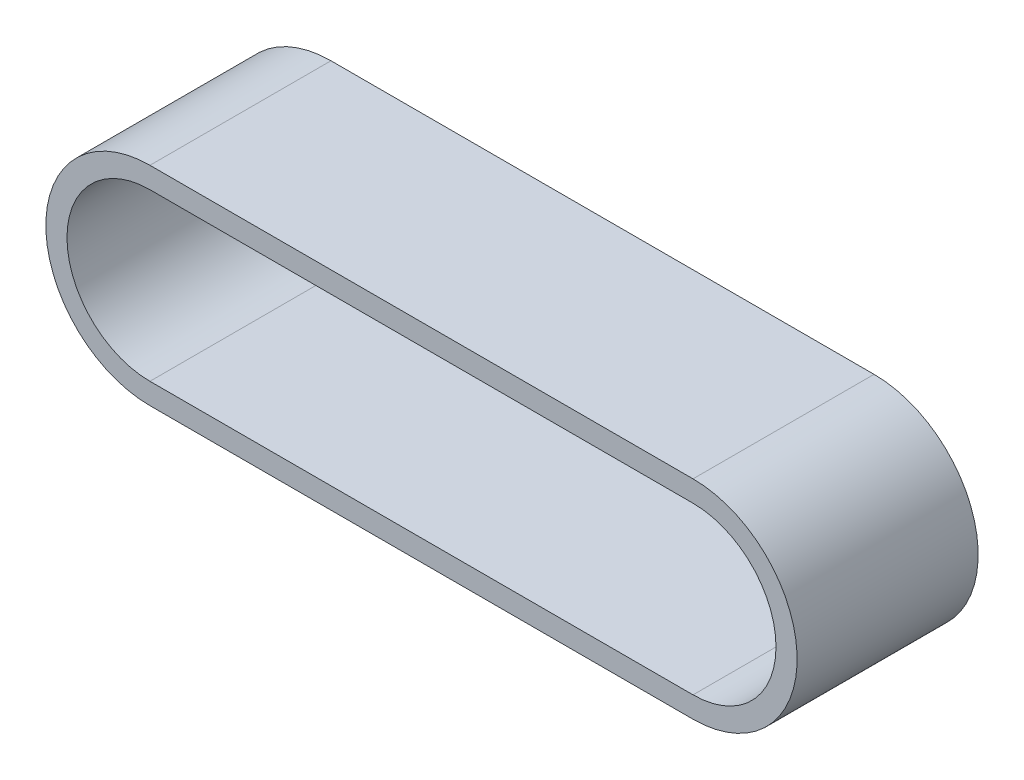
ISO-10303-21;
HEADER;
FILE_DESCRIPTION(('STEP AP214'),'2;1');
FILE_NAME('part.step','',(''),(''),'','','');
FILE_SCHEMA(('AUTOMOTIVE_DESIGN { 1 0 10303 214 1 1 1 1 }'));
ENDSEC;
DATA;
#1=APPLICATION_CONTEXT('core data for automotive mechanical design processes');
#2=APPLICATION_PROTOCOL_DEFINITION('international standard','automotive_design',2000,#1);
#3=PRODUCT_CONTEXT('',#1,'mechanical');
#4=PRODUCT('Part','Part','',(#3));
#5=PRODUCT_RELATED_PRODUCT_CATEGORY('part','',(#4));
#6=PRODUCT_DEFINITION_FORMATION('','',#4);
#7=PRODUCT_DEFINITION_CONTEXT('part definition',#1,'design');
#8=PRODUCT_DEFINITION('design','',#6,#7);
#9=PRODUCT_DEFINITION_SHAPE('','',#8);
#10=(LENGTH_UNIT() NAMED_UNIT(*) SI_UNIT(.MILLI.,.METRE.));
#11=(NAMED_UNIT(*) PLANE_ANGLE_UNIT() SI_UNIT($,.RADIAN.));
#12=(NAMED_UNIT(*) SI_UNIT($,.STERADIAN.) SOLID_ANGLE_UNIT());
#13=UNCERTAINTY_MEASURE_WITH_UNIT(LENGTH_MEASURE(1.E-05),#10,'distance_accuracy_value','');
#14=(GEOMETRIC_REPRESENTATION_CONTEXT(3) GLOBAL_UNCERTAINTY_ASSIGNED_CONTEXT((#13)) GLOBAL_UNIT_ASSIGNED_CONTEXT((#10,
#11,#12)) REPRESENTATION_CONTEXT('',''));
#15=CARTESIAN_POINT('',(0.,0.,0.));
#16=DIRECTION('',(0.,0.,1.));
#17=DIRECTION('',(1.,0.,0.));
#18=AXIS2_PLACEMENT_3D('',#15,#16,#17);
#19=CARTESIAN_POINT('',(0.,0.,12.));
#20=DIRECTION('',(0.,0.,1.));
#21=DIRECTION('',(1.,0.,0.));
#22=AXIS2_PLACEMENT_3D('',#19,#20,#21);
#23=PLANE('',#22);
#24=CARTESIAN_POINT('',(0.,0.,12.));
#25=DIRECTION('',(0.,0.,1.));
#26=DIRECTION('',(1.,0.,0.));
#27=AXIS2_PLACEMENT_3D('',#24,#25,#26);
#28=CIRCLE('',#27,6.9);
#29=CARTESIAN_POINT('',(0.,6.9,12.));
#30=VERTEX_POINT('',#29);
#31=CARTESIAN_POINT('',(0.,-6.9,12.));
#32=VERTEX_POINT('',#31);
#33=EDGE_CURVE('E135',#30,#32,#28,.T.);
#34=ORIENTED_EDGE('',*,*,#33,.T.);
#35=DIRECTION('',(1.,0.,0.));
#36=VECTOR('',#35,1.);
#37=CARTESIAN_POINT('',(0.,-6.9,12.));
#38=LINE('',#37,#36);
#39=CARTESIAN_POINT('',(36.,-6.9,12.));
#40=VERTEX_POINT('',#39);
#41=EDGE_CURVE('E138',#32,#40,#38,.T.);
#42=ORIENTED_EDGE('',*,*,#41,.T.);
#43=CARTESIAN_POINT('',(36.,0.,12.));
#44=DIRECTION('',(0.,0.,1.));
#45=DIRECTION('',(1.,0.,0.));
#46=AXIS2_PLACEMENT_3D('',#43,#44,#45);
#47=CIRCLE('',#46,6.9);
#48=CARTESIAN_POINT('',(36.,6.9,12.));
#49=VERTEX_POINT('',#48);
#50=EDGE_CURVE('E141',#40,#49,#47,.T.);
#51=ORIENTED_EDGE('',*,*,#50,.T.);
#52=DIRECTION('',(-1.,0.,0.));
#53=VECTOR('',#52,1.);
#54=CARTESIAN_POINT('',(0.,6.9,12.));
#55=LINE('',#54,#53);
#56=EDGE_CURVE('E143',#49,#30,#55,.T.);
#57=ORIENTED_EDGE('',*,*,#56,.T.);
#58=EDGE_LOOP('',(#34,#42,#51,#57));
#59=FACE_BOUND('',#58,.T.);
#60=DIRECTION('',(1.,0.,0.));
#61=VECTOR('',#60,1.);
#62=CARTESIAN_POINT('',(0.,-5.5,12.));
#63=LINE('',#62,#61);
#64=CARTESIAN_POINT('',(0.,-5.5,12.));
#65=VERTEX_POINT('',#64);
#66=CARTESIAN_POINT('',(36.,-5.5,12.));
#67=VERTEX_POINT('',#66);
#68=EDGE_CURVE('E107',#65,#67,#63,.T.);
#69=ORIENTED_EDGE('',*,*,#68,.F.);
#70=CARTESIAN_POINT('',(0.,0.,12.));
#71=DIRECTION('',(0.,0.,1.));
#72=DIRECTION('',(1.,0.,0.));
#73=AXIS2_PLACEMENT_3D('',#70,#71,#72);
#74=CIRCLE('',#73,5.5);
#75=CARTESIAN_POINT('',(0.,5.5,12.));
#76=VERTEX_POINT('',#75);
#77=EDGE_CURVE('E99',#76,#65,#74,.T.);
#78=ORIENTED_EDGE('',*,*,#77,.F.);
#79=DIRECTION('',(-1.,0.,0.));
#80=VECTOR('',#79,1.);
#81=CARTESIAN_POINT('',(0.,5.5,12.));
#82=LINE('',#81,#80);
#83=CARTESIAN_POINT('',(36.,5.5,12.));
#84=VERTEX_POINT('',#83);
#85=EDGE_CURVE('E121',#84,#76,#82,.T.);
#86=ORIENTED_EDGE('',*,*,#85,.F.);
#87=CARTESIAN_POINT('',(36.,0.,12.));
#88=DIRECTION('',(0.,0.,1.));
#89=DIRECTION('',(1.,0.,0.));
#90=AXIS2_PLACEMENT_3D('',#87,#88,#89);
#91=CIRCLE('',#90,5.5);
#92=EDGE_CURVE('E119',#67,#84,#91,.T.);
#93=ORIENTED_EDGE('',*,*,#92,.F.);
#94=EDGE_LOOP('',(#69,#78,#86,#93));
#95=FACE_BOUND('',#94,.T.);
#96=ADVANCED_FACE('F34',(#59,#95),#23,.T.);
#97=CARTESIAN_POINT('',(0.,0.,0.));
#98=DIRECTION('',(0.,0.,1.));
#99=DIRECTION('',(1.,0.,0.));
#100=AXIS2_PLACEMENT_3D('',#97,#98,#99);
#101=PLANE('',#100);
#102=CARTESIAN_POINT('',(0.,0.,0.));
#103=DIRECTION('',(0.,0.,1.));
#104=DIRECTION('',(1.,0.,0.));
#105=AXIS2_PLACEMENT_3D('',#102,#103,#104);
#106=CIRCLE('',#105,6.9);
#107=CARTESIAN_POINT('',(0.,6.9,0.));
#108=VERTEX_POINT('',#107);
#109=CARTESIAN_POINT('',(0.,-6.9,0.));
#110=VERTEX_POINT('',#109);
#111=EDGE_CURVE('E115',#108,#110,#106,.T.);
#112=ORIENTED_EDGE('',*,*,#111,.F.);
#113=DIRECTION('',(-1.,0.,0.));
#114=VECTOR('',#113,1.);
#115=CARTESIAN_POINT('',(0.,6.9,0.));
#116=LINE('',#115,#114);
#117=CARTESIAN_POINT('',(36.,6.9,0.));
#118=VERTEX_POINT('',#117);
#119=EDGE_CURVE('E139',#118,#108,#116,.T.);
#120=ORIENTED_EDGE('',*,*,#119,.F.);
#121=CARTESIAN_POINT('',(36.,0.,0.));
#122=DIRECTION('',(0.,0.,1.));
#123=DIRECTION('',(1.,0.,0.));
#124=AXIS2_PLACEMENT_3D('',#121,#122,#123);
#125=CIRCLE('',#124,6.9);
#126=CARTESIAN_POINT('',(36.,-6.9,0.));
#127=VERTEX_POINT('',#126);
#128=EDGE_CURVE('E150',#127,#118,#125,.T.);
#129=ORIENTED_EDGE('',*,*,#128,.F.);
#130=DIRECTION('',(1.,0.,0.));
#131=VECTOR('',#130,1.);
#132=CARTESIAN_POINT('',(0.,-6.9,0.));
#133=LINE('',#132,#131);
#134=EDGE_CURVE('E148',#110,#127,#133,.T.);
#135=ORIENTED_EDGE('',*,*,#134,.F.);
#136=EDGE_LOOP('',(#112,#120,#129,#135));
#137=FACE_BOUND('',#136,.T.);
#138=CARTESIAN_POINT('',(0.,0.,0.));
#139=DIRECTION('',(0.,0.,1.));
#140=DIRECTION('',(1.,0.,0.));
#141=AXIS2_PLACEMENT_3D('',#138,#139,#140);
#142=CIRCLE('',#141,5.5);
#143=CARTESIAN_POINT('',(0.,5.5,0.));
#144=VERTEX_POINT('',#143);
#145=CARTESIAN_POINT('',(0.,-5.5,0.));
#146=VERTEX_POINT('',#145);
#147=EDGE_CURVE('E57',#144,#146,#142,.T.);
#148=ORIENTED_EDGE('',*,*,#147,.T.);
#149=DIRECTION('',(1.,0.,0.));
#150=VECTOR('',#149,1.);
#151=CARTESIAN_POINT('',(0.,-5.5,0.));
#152=LINE('',#151,#150);
#153=CARTESIAN_POINT('',(36.,-5.5,0.));
#154=VERTEX_POINT('',#153);
#155=EDGE_CURVE('E114',#146,#154,#152,.T.);
#156=ORIENTED_EDGE('',*,*,#155,.T.);
#157=CARTESIAN_POINT('',(36.,0.,0.));
#158=DIRECTION('',(0.,0.,1.));
#159=DIRECTION('',(1.,0.,0.));
#160=AXIS2_PLACEMENT_3D('',#157,#158,#159);
#161=CIRCLE('',#160,5.5);
#162=CARTESIAN_POINT('',(36.,5.5,0.));
#163=VERTEX_POINT('',#162);
#164=EDGE_CURVE('E127',#154,#163,#161,.T.);
#165=ORIENTED_EDGE('',*,*,#164,.T.);
#166=DIRECTION('',(-1.,0.,0.));
#167=VECTOR('',#166,1.);
#168=CARTESIAN_POINT('',(0.,5.5,0.));
#169=LINE('',#168,#167);
#170=EDGE_CURVE('E108',#163,#144,#169,.T.);
#171=ORIENTED_EDGE('',*,*,#170,.T.);
#172=EDGE_LOOP('',(#148,#156,#165,#171));
#173=FACE_BOUND('',#172,.T.);
#174=ADVANCED_FACE('F168',(#137,#173),#101,.F.);
#175=CARTESIAN_POINT('',(0.,0.,12.));
#176=DIRECTION('',(0.,0.,-1.));
#177=DIRECTION('',(-1.,0.,0.));
#178=AXIS2_PLACEMENT_3D('',#175,#176,#177);
#179=CYLINDRICAL_SURFACE('',#178,6.9);
#180=ORIENTED_EDGE('',*,*,#111,.T.);
#181=DIRECTION('',(0.,0.,-1.));
#182=VECTOR('',#181,1.);
#183=CARTESIAN_POINT('',(0.,-6.9,12.));
#184=LINE('',#183,#182);
#185=EDGE_CURVE('E11',#32,#110,#184,.T.);
#186=ORIENTED_EDGE('',*,*,#185,.F.);
#187=ORIENTED_EDGE('',*,*,#33,.F.);
#188=DIRECTION('',(0.,0.,-1.));
#189=VECTOR('',#188,1.);
#190=CARTESIAN_POINT('',(0.,6.9,12.));
#191=LINE('',#190,#189);
#192=EDGE_CURVE('E145',#30,#108,#191,.T.);
#193=ORIENTED_EDGE('',*,*,#192,.T.);
#194=EDGE_LOOP('',(#180,#186,#187,#193));
#195=FACE_BOUND('',#194,.T.);
#196=ADVANCED_FACE('F36',(#195),#179,.T.);
#197=CARTESIAN_POINT('',(0.,-6.9,12.));
#198=DIRECTION('',(0.,1.,0.));
#199=DIRECTION('',(0.,0.,1.));
#200=AXIS2_PLACEMENT_3D('',#197,#198,#199);
#201=PLANE('',#200);
#202=ORIENTED_EDGE('',*,*,#134,.T.);
#203=DIRECTION('',(0.,0.,-1.));
#204=VECTOR('',#203,1.);
#205=CARTESIAN_POINT('',(36.,-6.9,12.));
#206=LINE('',#205,#204);
#207=EDGE_CURVE('E42',#40,#127,#206,.T.);
#208=ORIENTED_EDGE('',*,*,#207,.F.);
#209=ORIENTED_EDGE('',*,*,#41,.F.);
#210=ORIENTED_EDGE('',*,*,#185,.T.);
#211=EDGE_LOOP('',(#202,#208,#209,#210));
#212=FACE_BOUND('',#211,.T.);
#213=ADVANCED_FACE('F178',(#212),#201,.F.);
#214=CARTESIAN_POINT('',(36.,0.,12.));
#215=DIRECTION('',(0.,0.,-1.));
#216=DIRECTION('',(-1.,0.,0.));
#217=AXIS2_PLACEMENT_3D('',#214,#215,#216);
#218=CYLINDRICAL_SURFACE('',#217,6.9);
#219=ORIENTED_EDGE('',*,*,#128,.T.);
#220=DIRECTION('',(0.,0.,-1.));
#221=VECTOR('',#220,1.);
#222=CARTESIAN_POINT('',(36.,6.9,12.));
#223=LINE('',#222,#221);
#224=EDGE_CURVE('E155',#49,#118,#223,.T.);
#225=ORIENTED_EDGE('',*,*,#224,.F.);
#226=ORIENTED_EDGE('',*,*,#50,.F.);
#227=ORIENTED_EDGE('',*,*,#207,.T.);
#228=EDGE_LOOP('',(#219,#225,#226,#227));
#229=FACE_BOUND('',#228,.T.);
#230=ADVANCED_FACE('F162',(#229),#218,.T.);
#231=CARTESIAN_POINT('',(0.,6.9,12.));
#232=DIRECTION('',(0.,-1.,0.));
#233=DIRECTION('',(0.,0.,-1.));
#234=AXIS2_PLACEMENT_3D('',#231,#232,#233);
#235=PLANE('',#234);
#236=ORIENTED_EDGE('',*,*,#119,.T.);
#237=ORIENTED_EDGE('',*,*,#192,.F.);
#238=ORIENTED_EDGE('',*,*,#56,.F.);
#239=ORIENTED_EDGE('',*,*,#224,.T.);
#240=EDGE_LOOP('',(#236,#237,#238,#239));
#241=FACE_BOUND('',#240,.T.);
#242=ADVANCED_FACE('F172',(#241),#235,.F.);
#243=CARTESIAN_POINT('',(0.,0.,12.));
#244=DIRECTION('',(0.,0.,-1.));
#245=DIRECTION('',(-1.,0.,0.));
#246=AXIS2_PLACEMENT_3D('',#243,#244,#245);
#247=CYLINDRICAL_SURFACE('',#246,5.5);
#248=ORIENTED_EDGE('',*,*,#147,.F.);
#249=DIRECTION('',(0.,0.,-1.));
#250=VECTOR('',#249,1.);
#251=CARTESIAN_POINT('',(0.,5.5,12.));
#252=LINE('',#251,#250);
#253=EDGE_CURVE('E103',#76,#144,#252,.T.);
#254=ORIENTED_EDGE('',*,*,#253,.F.);
#255=ORIENTED_EDGE('',*,*,#77,.T.);
#256=DIRECTION('',(0.,0.,-1.));
#257=VECTOR('',#256,1.);
#258=CARTESIAN_POINT('',(0.,-5.5,12.));
#259=LINE('',#258,#257);
#260=EDGE_CURVE('E102',#65,#146,#259,.T.);
#261=ORIENTED_EDGE('',*,*,#260,.T.);
#262=EDGE_LOOP('',(#248,#254,#255,#261));
#263=FACE_BOUND('',#262,.T.);
#264=ADVANCED_FACE('F101',(#263),#247,.F.);
#265=CARTESIAN_POINT('',(0.,-5.5,12.));
#266=DIRECTION('',(0.,1.,0.));
#267=DIRECTION('',(0.,0.,1.));
#268=AXIS2_PLACEMENT_3D('',#265,#266,#267);
#269=PLANE('',#268);
#270=ORIENTED_EDGE('',*,*,#155,.F.);
#271=ORIENTED_EDGE('',*,*,#260,.F.);
#272=ORIENTED_EDGE('',*,*,#68,.T.);
#273=DIRECTION('',(0.,0.,-1.));
#274=VECTOR('',#273,1.);
#275=CARTESIAN_POINT('',(36.,-5.5,12.));
#276=LINE('',#275,#274);
#277=EDGE_CURVE('E116',#67,#154,#276,.T.);
#278=ORIENTED_EDGE('',*,*,#277,.T.);
#279=EDGE_LOOP('',(#270,#271,#272,#278));
#280=FACE_BOUND('',#279,.T.);
#281=ADVANCED_FACE('F111',(#280),#269,.T.);
#282=CARTESIAN_POINT('',(36.,0.,12.));
#283=DIRECTION('',(0.,0.,-1.));
#284=DIRECTION('',(-1.,0.,0.));
#285=AXIS2_PLACEMENT_3D('',#282,#283,#284);
#286=CYLINDRICAL_SURFACE('',#285,5.5);
#287=ORIENTED_EDGE('',*,*,#164,.F.);
#288=ORIENTED_EDGE('',*,*,#277,.F.);
#289=ORIENTED_EDGE('',*,*,#92,.T.);
#290=DIRECTION('',(0.,0.,-1.));
#291=VECTOR('',#290,1.);
#292=CARTESIAN_POINT('',(36.,5.5,12.));
#293=LINE('',#292,#291);
#294=EDGE_CURVE('E49',#84,#163,#293,.T.);
#295=ORIENTED_EDGE('',*,*,#294,.T.);
#296=EDGE_LOOP('',(#287,#288,#289,#295));
#297=FACE_BOUND('',#296,.T.);
#298=ADVANCED_FACE('F201',(#297),#286,.F.);
#299=CARTESIAN_POINT('',(0.,5.5,12.));
#300=DIRECTION('',(0.,-1.,0.));
#301=DIRECTION('',(0.,0.,-1.));
#302=AXIS2_PLACEMENT_3D('',#299,#300,#301);
#303=PLANE('',#302);
#304=ORIENTED_EDGE('',*,*,#170,.F.);
#305=ORIENTED_EDGE('',*,*,#294,.F.);
#306=ORIENTED_EDGE('',*,*,#85,.T.);
#307=ORIENTED_EDGE('',*,*,#253,.T.);
#308=EDGE_LOOP('',(#304,#305,#306,#307));
#309=FACE_BOUND('',#308,.T.);
#310=ADVANCED_FACE('F205',(#309),#303,.T.);
#311=CLOSED_SHELL('',(#96,#174,#196,#213,#230,#242,#264,#281,#298,#310));
#312=MANIFOLD_SOLID_BREP('B2',#311);
#313=ADVANCED_BREP_SHAPE_REPRESENTATION('',(#18,#312),#14);
#314=SHAPE_DEFINITION_REPRESENTATION(#9,#313);
ENDSEC;
END-ISO-10303-21;
